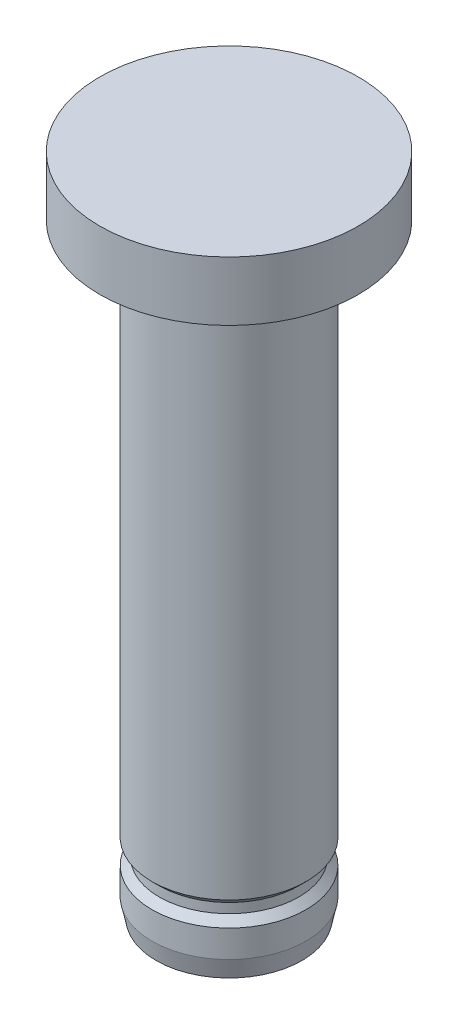
ISO-10303-21;
HEADER;
FILE_DESCRIPTION(('STEP AP214'),'2;1');
FILE_NAME('part.step','',(''),(''),'','','');
FILE_SCHEMA(('AUTOMOTIVE_DESIGN { 1 0 10303 214 1 1 1 1 }'));
ENDSEC;
DATA;
#1=APPLICATION_CONTEXT('core data for automotive mechanical design processes');
#2=APPLICATION_PROTOCOL_DEFINITION('international standard','automotive_design',2000,#1);
#3=PRODUCT_CONTEXT('',#1,'mechanical');
#4=PRODUCT('Part','Part','',(#3));
#5=PRODUCT_RELATED_PRODUCT_CATEGORY('part','',(#4));
#6=PRODUCT_DEFINITION_FORMATION('','',#4);
#7=PRODUCT_DEFINITION_CONTEXT('part definition',#1,'design');
#8=PRODUCT_DEFINITION('design','',#6,#7);
#9=PRODUCT_DEFINITION_SHAPE('','',#8);
#10=(LENGTH_UNIT() NAMED_UNIT(*) SI_UNIT(.MILLI.,.METRE.));
#11=(NAMED_UNIT(*) PLANE_ANGLE_UNIT() SI_UNIT($,.RADIAN.));
#12=(NAMED_UNIT(*) SI_UNIT($,.STERADIAN.) SOLID_ANGLE_UNIT());
#13=UNCERTAINTY_MEASURE_WITH_UNIT(LENGTH_MEASURE(1.E-05),#10,'distance_accuracy_value','');
#14=(GEOMETRIC_REPRESENTATION_CONTEXT(3) GLOBAL_UNCERTAINTY_ASSIGNED_CONTEXT((#13)) GLOBAL_UNIT_ASSIGNED_CONTEXT((#10,
#11,#12)) REPRESENTATION_CONTEXT('',''));
#15=CARTESIAN_POINT('',(0.,0.,0.));
#16=DIRECTION('',(0.,0.,1.));
#17=DIRECTION('',(1.,0.,0.));
#18=AXIS2_PLACEMENT_3D('',#15,#16,#17);
#19=CARTESIAN_POINT('',(15.,-68.35,0.));
#20=DIRECTION('',(0.,-1.,0.));
#21=DIRECTION('',(0.,0.,-1.));
#22=AXIS2_PLACEMENT_3D('',#19,#20,#21);
#23=PLANE('',#22);
#24=CARTESIAN_POINT('',(0.,-68.35,0.));
#25=DIRECTION('',(0.,1.,0.));
#26=DIRECTION('',(0.,0.,1.));
#27=AXIS2_PLACEMENT_3D('',#24,#25,#26);
#28=CIRCLE('',#27,15.);
#29=CARTESIAN_POINT('',(0.,-68.35,15.));
#30=VERTEX_POINT('',#29);
#31=EDGE_CURVE('E63',#30,#30,#28,.T.);
#32=ORIENTED_EDGE('',*,*,#31,.F.);
#33=EDGE_LOOP('',(#32));
#34=FACE_BOUND('',#33,.T.);
#35=ADVANCED_FACE('F32',(#34),#23,.T.);
#36=CARTESIAN_POINT('',(0.,68.35,0.));
#37=DIRECTION('',(0.,1.,0.));
#38=DIRECTION('',(0.,0.,1.));
#39=AXIS2_PLACEMENT_3D('',#36,#37,#38);
#40=PLANE('',#39);
#41=CARTESIAN_POINT('',(0.,68.35,0.));
#42=DIRECTION('',(0.,1.,0.));
#43=DIRECTION('',(0.,0.,1.));
#44=AXIS2_PLACEMENT_3D('',#41,#42,#43);
#45=CIRCLE('',#44,26.6);
#46=CARTESIAN_POINT('',(0.,68.35,26.6));
#47=VERTEX_POINT('',#46);
#48=EDGE_CURVE('E10',#47,#47,#45,.T.);
#49=ORIENTED_EDGE('',*,*,#48,.T.);
#50=EDGE_LOOP('',(#49));
#51=FACE_BOUND('',#50,.T.);
#52=ADVANCED_FACE('F71',(#51),#40,.T.);
#53=CARTESIAN_POINT('',(0.,107.931381584058,0.));
#54=DIRECTION('',(0.,1.,0.));
#55=DIRECTION('',(0.,0.,1.));
#56=AXIS2_PLACEMENT_3D('',#53,#54,#55);
#57=CYLINDRICAL_SURFACE('',#56,26.6);
#58=CARTESIAN_POINT('',(0.,56.15,0.));
#59=DIRECTION('',(0.,1.,0.));
#60=DIRECTION('',(0.,0.,1.));
#61=AXIS2_PLACEMENT_3D('',#58,#59,#60);
#62=CIRCLE('',#61,26.6);
#63=CARTESIAN_POINT('',(0.,56.15,26.6));
#64=VERTEX_POINT('',#63);
#65=EDGE_CURVE('E38',#64,#64,#62,.T.);
#66=ORIENTED_EDGE('',*,*,#65,.T.);
#67=EDGE_LOOP('',(#66));
#68=FACE_BOUND('',#67,.T.);
#69=ORIENTED_EDGE('',*,*,#48,.F.);
#70=EDGE_LOOP('',(#69));
#71=FACE_BOUND('',#70,.T.);
#72=ADVANCED_FACE('F75',(#68,#71),#57,.T.);
#73=CARTESIAN_POINT('',(26.6,56.15,0.));
#74=DIRECTION('',(0.,-1.,0.));
#75=DIRECTION('',(0.,0.,-1.));
#76=AXIS2_PLACEMENT_3D('',#73,#74,#75);
#77=PLANE('',#76);
#78=CARTESIAN_POINT('',(0.,56.15,0.));
#79=DIRECTION('',(0.,1.,0.));
#80=DIRECTION('',(0.,0.,1.));
#81=AXIS2_PLACEMENT_3D('',#78,#79,#80);
#82=CIRCLE('',#81,15.85);
#83=CARTESIAN_POINT('',(0.,56.15,15.85));
#84=VERTEX_POINT('',#83);
#85=EDGE_CURVE('E42',#84,#84,#82,.T.);
#86=ORIENTED_EDGE('',*,*,#85,.T.);
#87=EDGE_LOOP('',(#86));
#88=FACE_BOUND('',#87,.T.);
#89=ORIENTED_EDGE('',*,*,#65,.F.);
#90=EDGE_LOOP('',(#89));
#91=FACE_BOUND('',#90,.T.);
#92=ADVANCED_FACE('F79',(#88,#91),#77,.T.);
#93=CARTESIAN_POINT('',(0.,107.931381584058,0.));
#94=DIRECTION('',(0.,1.,0.));
#95=DIRECTION('',(0.,0.,1.));
#96=AXIS2_PLACEMENT_3D('',#93,#94,#95);
#97=CYLINDRICAL_SURFACE('',#96,15.85);
#98=CARTESIAN_POINT('',(0.,-53.85,0.));
#99=DIRECTION('',(0.,1.,0.));
#100=DIRECTION('',(0.,0.,1.));
#101=AXIS2_PLACEMENT_3D('',#98,#99,#100);
#102=CIRCLE('',#101,15.85);
#103=CARTESIAN_POINT('',(0.,-53.85,15.85));
#104=VERTEX_POINT('',#103);
#105=EDGE_CURVE('E46',#104,#104,#102,.T.);
#106=ORIENTED_EDGE('',*,*,#105,.T.);
#107=EDGE_LOOP('',(#106));
#108=FACE_BOUND('',#107,.T.);
#109=ORIENTED_EDGE('',*,*,#85,.F.);
#110=EDGE_LOOP('',(#109));
#111=FACE_BOUND('',#110,.T.);
#112=ADVANCED_FACE('F84',(#108,#111),#97,.T.);
#113=CARTESIAN_POINT('',(0.,-53.85,0.));
#114=DIRECTION('',(0.,1.,0.));
#115=DIRECTION('',(0.,0.,1.));
#116=AXIS2_PLACEMENT_3D('',#113,#114,#115);
#117=CONICAL_SURFACE('',#116,15.85,0.785398163397448);
#118=CARTESIAN_POINT('',(0.,-55.35,0.));
#119=DIRECTION('',(0.,1.,0.));
#120=DIRECTION('',(0.,0.,1.));
#121=AXIS2_PLACEMENT_3D('',#118,#119,#120);
#122=CIRCLE('',#121,14.35);
#123=CARTESIAN_POINT('',(0.,-55.35,14.35));
#124=VERTEX_POINT('',#123);
#125=EDGE_CURVE('E51',#124,#124,#122,.T.);
#126=ORIENTED_EDGE('',*,*,#125,.T.);
#127=EDGE_LOOP('',(#126));
#128=FACE_BOUND('',#127,.T.);
#129=ORIENTED_EDGE('',*,*,#105,.F.);
#130=EDGE_LOOP('',(#129));
#131=FACE_BOUND('',#130,.T.);
#132=ADVANCED_FACE('F88',(#128,#131),#117,.T.);
#133=CARTESIAN_POINT('',(0.,107.931381584058,0.));
#134=DIRECTION('',(0.,1.,0.));
#135=DIRECTION('',(0.,0.,1.));
#136=AXIS2_PLACEMENT_3D('',#133,#134,#135);
#137=CYLINDRICAL_SURFACE('',#136,14.35);
#138=CARTESIAN_POINT('',(0.,-57.35,0.));
#139=DIRECTION('',(0.,1.,0.));
#140=DIRECTION('',(0.,0.,1.));
#141=AXIS2_PLACEMENT_3D('',#138,#139,#140);
#142=CIRCLE('',#141,14.35);
#143=CARTESIAN_POINT('',(0.,-57.35,14.35));
#144=VERTEX_POINT('',#143);
#145=EDGE_CURVE('E54',#144,#144,#142,.T.);
#146=ORIENTED_EDGE('',*,*,#145,.T.);
#147=EDGE_LOOP('',(#146));
#148=FACE_BOUND('',#147,.T.);
#149=ORIENTED_EDGE('',*,*,#125,.F.);
#150=EDGE_LOOP('',(#149));
#151=FACE_BOUND('',#150,.T.);
#152=ADVANCED_FACE('F92',(#148,#151),#137,.T.);
#153=CARTESIAN_POINT('',(0.,-57.35,0.));
#154=DIRECTION('',(0.,-1.,0.));
#155=DIRECTION('',(0.,0.,-1.));
#156=AXIS2_PLACEMENT_3D('',#153,#154,#155);
#157=CONICAL_SURFACE('',#156,14.35,0.785398163397448);
#158=CARTESIAN_POINT('',(0.,-58.85,0.));
#159=DIRECTION('',(0.,1.,0.));
#160=DIRECTION('',(0.,0.,1.));
#161=AXIS2_PLACEMENT_3D('',#158,#159,#160);
#162=CIRCLE('',#161,15.85);
#163=CARTESIAN_POINT('',(0.,-58.85,15.85));
#164=VERTEX_POINT('',#163);
#165=EDGE_CURVE('E57',#164,#164,#162,.T.);
#166=ORIENTED_EDGE('',*,*,#165,.T.);
#167=EDGE_LOOP('',(#166));
#168=FACE_BOUND('',#167,.T.);
#169=ORIENTED_EDGE('',*,*,#145,.F.);
#170=EDGE_LOOP('',(#169));
#171=FACE_BOUND('',#170,.T.);
#172=ADVANCED_FACE('F96',(#168,#171),#157,.T.);
#173=CARTESIAN_POINT('',(0.,107.931381584058,0.));
#174=DIRECTION('',(0.,1.,0.));
#175=DIRECTION('',(0.,0.,1.));
#176=AXIS2_PLACEMENT_3D('',#173,#174,#175);
#177=CYLINDRICAL_SURFACE('',#176,15.85);
#178=CARTESIAN_POINT('',(0.,-64.45,0.));
#179=DIRECTION('',(0.,1.,0.));
#180=DIRECTION('',(0.,0.,1.));
#181=AXIS2_PLACEMENT_3D('',#178,#179,#180);
#182=CIRCLE('',#181,15.85);
#183=CARTESIAN_POINT('',(0.,-64.45,15.85));
#184=VERTEX_POINT('',#183);
#185=EDGE_CURVE('E60',#184,#184,#182,.T.);
#186=ORIENTED_EDGE('',*,*,#185,.T.);
#187=EDGE_LOOP('',(#186));
#188=FACE_BOUND('',#187,.T.);
#189=ORIENTED_EDGE('',*,*,#165,.F.);
#190=EDGE_LOOP('',(#189));
#191=FACE_BOUND('',#190,.T.);
#192=ADVANCED_FACE('F100',(#188,#191),#177,.T.);
#193=CARTESIAN_POINT('',(0.,-64.45,0.));
#194=DIRECTION('',(0.,1.,0.));
#195=DIRECTION('',(0.,0.,1.));
#196=AXIS2_PLACEMENT_3D('',#193,#194,#195);
#197=CONICAL_SURFACE('',#196,15.85,0.21459288149122);
#198=ORIENTED_EDGE('',*,*,#31,.T.);
#199=EDGE_LOOP('',(#198));
#200=FACE_BOUND('',#199,.T.);
#201=ORIENTED_EDGE('',*,*,#185,.F.);
#202=EDGE_LOOP('',(#201));
#203=FACE_BOUND('',#202,.T.);
#204=ADVANCED_FACE('F67',(#200,#203),#197,.T.);
#205=CLOSED_SHELL('',(#35,#52,#72,#92,#112,#132,#152,#172,#192,#204));
#206=MANIFOLD_SOLID_BREP('B2',#205);
#207=ADVANCED_BREP_SHAPE_REPRESENTATION('',(#18,#206),#14);
#208=SHAPE_DEFINITION_REPRESENTATION(#9,#207);
ENDSEC;
END-ISO-10303-21;
